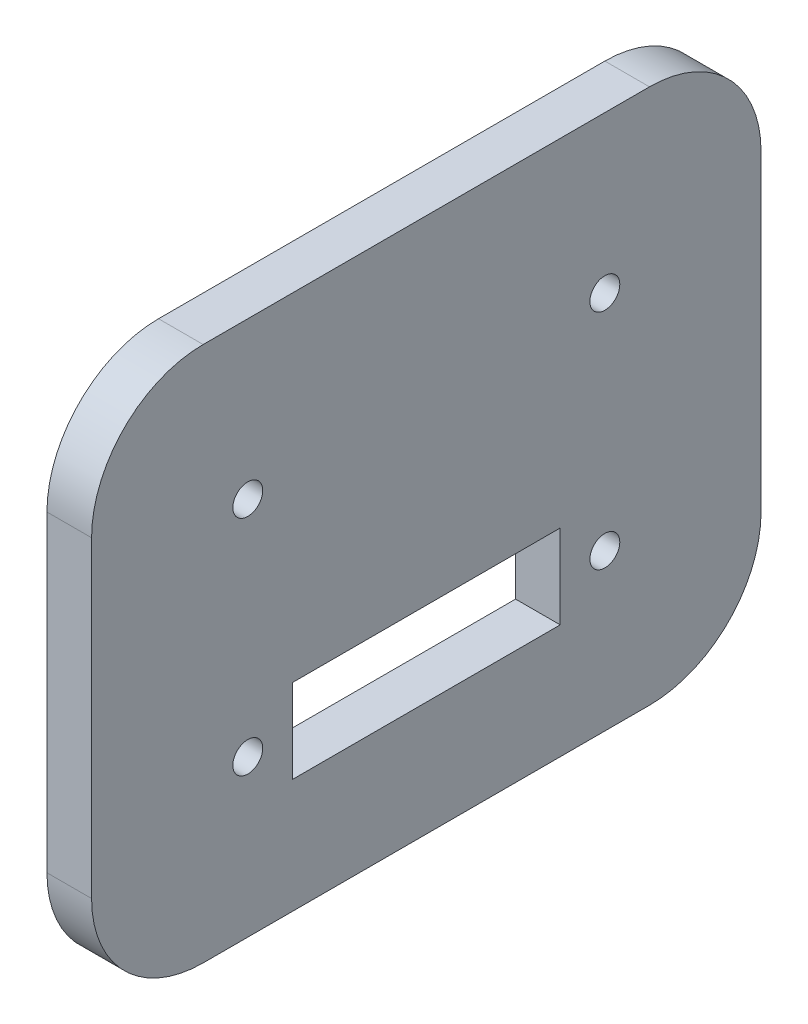
ISO-10303-21;
HEADER;
FILE_DESCRIPTION(('STEP AP214'),'2;1');
FILE_NAME('part.step','',(''),(''),'','','');
FILE_SCHEMA(('AUTOMOTIVE_DESIGN { 1 0 10303 214 1 1 1 1 }'));
ENDSEC;
DATA;
#1=APPLICATION_CONTEXT('core data for automotive mechanical design processes');
#2=APPLICATION_PROTOCOL_DEFINITION('international standard','automotive_design',2000,#1);
#3=PRODUCT_CONTEXT('',#1,'mechanical');
#4=PRODUCT('Part','Part','',(#3));
#5=PRODUCT_RELATED_PRODUCT_CATEGORY('part','',(#4));
#6=PRODUCT_DEFINITION_FORMATION('','',#4);
#7=PRODUCT_DEFINITION_CONTEXT('part definition',#1,'design');
#8=PRODUCT_DEFINITION('design','',#6,#7);
#9=PRODUCT_DEFINITION_SHAPE('','',#8);
#10=(LENGTH_UNIT() NAMED_UNIT(*) SI_UNIT(.MILLI.,.METRE.));
#11=(NAMED_UNIT(*) PLANE_ANGLE_UNIT() SI_UNIT($,.RADIAN.));
#12=(NAMED_UNIT(*) SI_UNIT($,.STERADIAN.) SOLID_ANGLE_UNIT());
#13=UNCERTAINTY_MEASURE_WITH_UNIT(LENGTH_MEASURE(1.E-05),#10,'distance_accuracy_value','');
#14=(GEOMETRIC_REPRESENTATION_CONTEXT(3) GLOBAL_UNCERTAINTY_ASSIGNED_CONTEXT((#13)) GLOBAL_UNIT_ASSIGNED_CONTEXT((#10,
#11,#12)) REPRESENTATION_CONTEXT('',''));
#15=CARTESIAN_POINT('',(0.,0.,0.));
#16=DIRECTION('',(0.,0.,1.));
#17=DIRECTION('',(1.,0.,0.));
#18=AXIS2_PLACEMENT_3D('',#15,#16,#17);
#19=CARTESIAN_POINT('',(2.54,-15.24,-19.05));
#20=DIRECTION('',(0.,0.,1.));
#21=DIRECTION('',(1.,0.,0.));
#22=AXIS2_PLACEMENT_3D('',#19,#20,#21);
#23=PLANE('',#22);
#24=DIRECTION('',(0.,1.,0.));
#25=VECTOR('',#24,1.);
#26=CARTESIAN_POINT('',(0.,-15.24,-19.05));
#27=LINE('',#26,#25);
#28=CARTESIAN_POINT('',(0.,-8.89,-19.05));
#29=VERTEX_POINT('',#28);
#30=CARTESIAN_POINT('',(0.,8.88999999999999,-19.05));
#31=VERTEX_POINT('',#30);
#32=EDGE_CURVE('E179',#29,#31,#27,.T.);
#33=ORIENTED_EDGE('',*,*,#32,.T.);
#34=DIRECTION('',(-1.,0.,0.));
#35=VECTOR('',#34,1.);
#36=CARTESIAN_POINT('',(2.54,8.89,-19.05));
#37=LINE('',#36,#35);
#38=CARTESIAN_POINT('',(2.54,8.88999999999999,-19.05));
#39=VERTEX_POINT('',#38);
#40=EDGE_CURVE('E221',#31,#39,#37,.F.);
#41=ORIENTED_EDGE('',*,*,#40,.T.);
#42=DIRECTION('',(0.,1.,0.));
#43=VECTOR('',#42,1.);
#44=CARTESIAN_POINT('',(2.54,-15.24,-19.05));
#45=LINE('',#44,#43);
#46=CARTESIAN_POINT('',(2.54,-8.89,-19.05));
#47=VERTEX_POINT('',#46);
#48=EDGE_CURVE('E182',#47,#39,#45,.T.);
#49=ORIENTED_EDGE('',*,*,#48,.F.);
#50=DIRECTION('',(-1.,0.,0.));
#51=VECTOR('',#50,1.);
#52=CARTESIAN_POINT('',(2.54,-8.89,-19.05));
#53=LINE('',#52,#51);
#54=EDGE_CURVE('E218',#47,#29,#53,.T.);
#55=ORIENTED_EDGE('',*,*,#54,.T.);
#56=EDGE_LOOP('',(#33,#41,#49,#55));
#57=FACE_BOUND('',#56,.T.);
#58=ADVANCED_FACE('F33',(#57),#23,.F.);
#59=CARTESIAN_POINT('',(2.54,15.24,19.05));
#60=DIRECTION('',(0.,-1.,0.));
#61=DIRECTION('',(0.,0.,-1.));
#62=AXIS2_PLACEMENT_3D('',#59,#60,#61);
#63=PLANE('',#62);
#64=DIRECTION('',(0.,0.,1.));
#65=VECTOR('',#64,1.);
#66=CARTESIAN_POINT('',(2.54,15.24,19.05));
#67=LINE('',#66,#65);
#68=CARTESIAN_POINT('',(2.54,15.24,-12.7));
#69=VERTEX_POINT('',#68);
#70=CARTESIAN_POINT('',(2.54,15.24,12.7));
#71=VERTEX_POINT('',#70);
#72=EDGE_CURVE('E185',#69,#71,#67,.T.);
#73=ORIENTED_EDGE('',*,*,#72,.F.);
#74=DIRECTION('',(-1.,0.,0.));
#75=VECTOR('',#74,1.);
#76=CARTESIAN_POINT('',(2.54,15.24,-12.7));
#77=LINE('',#76,#75);
#78=CARTESIAN_POINT('',(0.,15.24,-12.7));
#79=VERTEX_POINT('',#78);
#80=EDGE_CURVE('E207',#69,#79,#77,.T.);
#81=ORIENTED_EDGE('',*,*,#80,.T.);
#82=DIRECTION('',(0.,0.,1.));
#83=VECTOR('',#82,1.);
#84=CARTESIAN_POINT('',(0.,15.24,19.05));
#85=LINE('',#84,#83);
#86=CARTESIAN_POINT('',(0.,15.24,12.7));
#87=VERTEX_POINT('',#86);
#88=EDGE_CURVE('E198',#79,#87,#85,.T.);
#89=ORIENTED_EDGE('',*,*,#88,.T.);
#90=DIRECTION('',(-1.,0.,0.));
#91=VECTOR('',#90,1.);
#92=CARTESIAN_POINT('',(2.54,15.24,12.7));
#93=LINE('',#92,#91);
#94=EDGE_CURVE('E195',#87,#71,#93,.F.);
#95=ORIENTED_EDGE('',*,*,#94,.T.);
#96=EDGE_LOOP('',(#73,#81,#89,#95));
#97=FACE_BOUND('',#96,.T.);
#98=ADVANCED_FACE('F271',(#97),#63,.F.);
#99=CARTESIAN_POINT('',(2.54,-15.24,19.05));
#100=DIRECTION('',(0.,0.,-1.));
#101=DIRECTION('',(-1.,0.,0.));
#102=AXIS2_PLACEMENT_3D('',#99,#100,#101);
#103=PLANE('',#102);
#104=DIRECTION('',(0.,-1.,0.));
#105=VECTOR('',#104,1.);
#106=CARTESIAN_POINT('',(0.,-15.24,19.05));
#107=LINE('',#106,#105);
#108=CARTESIAN_POINT('',(0.,8.88999999999999,19.05));
#109=VERTEX_POINT('',#108);
#110=CARTESIAN_POINT('',(0.,-8.89,19.05));
#111=VERTEX_POINT('',#110);
#112=EDGE_CURVE('E201',#109,#111,#107,.T.);
#113=ORIENTED_EDGE('',*,*,#112,.T.);
#114=DIRECTION('',(-1.,0.,0.));
#115=VECTOR('',#114,1.);
#116=CARTESIAN_POINT('',(2.54,-8.89,19.05));
#117=LINE('',#116,#115);
#118=CARTESIAN_POINT('',(2.54,-8.89,19.05));
#119=VERTEX_POINT('',#118);
#120=EDGE_CURVE('E11',#111,#119,#117,.F.);
#121=ORIENTED_EDGE('',*,*,#120,.T.);
#122=DIRECTION('',(0.,-1.,0.));
#123=VECTOR('',#122,1.);
#124=CARTESIAN_POINT('',(2.54,-15.24,19.05));
#125=LINE('',#124,#123);
#126=CARTESIAN_POINT('',(2.54,8.88999999999999,19.05));
#127=VERTEX_POINT('',#126);
#128=EDGE_CURVE('E189',#127,#119,#125,.T.);
#129=ORIENTED_EDGE('',*,*,#128,.F.);
#130=DIRECTION('',(-1.,0.,0.));
#131=VECTOR('',#130,1.);
#132=CARTESIAN_POINT('',(2.54,8.89,19.05));
#133=LINE('',#132,#131);
#134=EDGE_CURVE('E41',#127,#109,#133,.T.);
#135=ORIENTED_EDGE('',*,*,#134,.T.);
#136=EDGE_LOOP('',(#113,#121,#129,#135));
#137=FACE_BOUND('',#136,.T.);
#138=ADVANCED_FACE('F240',(#137),#103,.F.);
#139=CARTESIAN_POINT('',(2.54,-15.24,19.05));
#140=DIRECTION('',(0.,1.,0.));
#141=DIRECTION('',(0.,0.,1.));
#142=AXIS2_PLACEMENT_3D('',#139,#140,#141);
#143=PLANE('',#142);
#144=DIRECTION('',(0.,0.,-1.));
#145=VECTOR('',#144,1.);
#146=CARTESIAN_POINT('',(0.,-15.24,19.05));
#147=LINE('',#146,#145);
#148=CARTESIAN_POINT('',(0.,-15.24,12.7));
#149=VERTEX_POINT('',#148);
#150=CARTESIAN_POINT('',(0.,-15.24,-12.7));
#151=VERTEX_POINT('',#150);
#152=EDGE_CURVE('E186',#149,#151,#147,.T.);
#153=ORIENTED_EDGE('',*,*,#152,.T.);
#154=DIRECTION('',(-1.,0.,0.));
#155=VECTOR('',#154,1.);
#156=CARTESIAN_POINT('',(2.54,-15.24,-12.7));
#157=LINE('',#156,#155);
#158=CARTESIAN_POINT('',(2.54,-15.24,-12.7));
#159=VERTEX_POINT('',#158);
#160=EDGE_CURVE('E234',#151,#159,#157,.F.);
#161=ORIENTED_EDGE('',*,*,#160,.T.);
#162=DIRECTION('',(0.,0.,-1.));
#163=VECTOR('',#162,1.);
#164=CARTESIAN_POINT('',(2.54,-15.24,19.05));
#165=LINE('',#164,#163);
#166=CARTESIAN_POINT('',(2.54,-15.24,12.7));
#167=VERTEX_POINT('',#166);
#168=EDGE_CURVE('E192',#167,#159,#165,.T.);
#169=ORIENTED_EDGE('',*,*,#168,.F.);
#170=DIRECTION('',(-1.,0.,0.));
#171=VECTOR('',#170,1.);
#172=CARTESIAN_POINT('',(2.54,-15.24,12.7));
#173=LINE('',#172,#171);
#174=EDGE_CURVE('E231',#167,#149,#173,.T.);
#175=ORIENTED_EDGE('',*,*,#174,.T.);
#176=EDGE_LOOP('',(#153,#161,#169,#175));
#177=FACE_BOUND('',#176,.T.);
#178=ADVANCED_FACE('F253',(#177),#143,.F.);
#179=CARTESIAN_POINT('',(2.54,0.,0.));
#180=DIRECTION('',(-1.,0.,0.));
#181=DIRECTION('',(0.,0.,1.));
#182=AXIS2_PLACEMENT_3D('',#179,#180,#181);
#183=PLANE('',#182);
#184=DIRECTION('',(0.,0.,1.));
#185=VECTOR('',#184,1.);
#186=CARTESIAN_POINT('',(2.54,-3.9624,7.62));
#187=LINE('',#186,#185);
#188=CARTESIAN_POINT('',(2.54,-3.9624,-7.62));
#189=VERTEX_POINT('',#188);
#190=CARTESIAN_POINT('',(2.54,-3.9624,7.62));
#191=VERTEX_POINT('',#190);
#192=EDGE_CURVE('E148',#189,#191,#187,.T.);
#193=ORIENTED_EDGE('',*,*,#192,.F.);
#194=DIRECTION('',(0.,1.,0.));
#195=VECTOR('',#194,1.);
#196=CARTESIAN_POINT('',(2.54,-8.7376,-7.62));
#197=LINE('',#196,#195);
#198=CARTESIAN_POINT('',(2.54,-8.7376,-7.62));
#199=VERTEX_POINT('',#198);
#200=EDGE_CURVE('E48',#199,#189,#197,.T.);
#201=ORIENTED_EDGE('',*,*,#200,.F.);
#202=DIRECTION('',(0.,0.,-1.));
#203=VECTOR('',#202,1.);
#204=CARTESIAN_POINT('',(2.54,-8.7376,7.62));
#205=LINE('',#204,#203);
#206=CARTESIAN_POINT('',(2.54,-8.7376,7.62));
#207=VERTEX_POINT('',#206);
#208=EDGE_CURVE('E139',#207,#199,#205,.T.);
#209=ORIENTED_EDGE('',*,*,#208,.F.);
#210=DIRECTION('',(0.,-1.,0.));
#211=VECTOR('',#210,1.);
#212=CARTESIAN_POINT('',(2.54,-8.7376,7.62));
#213=LINE('',#212,#211);
#214=EDGE_CURVE('E142',#191,#207,#213,.T.);
#215=ORIENTED_EDGE('',*,*,#214,.F.);
#216=EDGE_LOOP('',(#193,#201,#209,#215));
#217=FACE_BOUND('',#216,.T.);
#218=CARTESIAN_POINT('',(2.54,-6.35,10.16));
#219=DIRECTION('',(1.,0.,0.));
#220=DIRECTION('',(0.,0.,1.));
#221=AXIS2_PLACEMENT_3D('',#218,#219,#220);
#222=CIRCLE('',#221,0.850900000000001);
#223=CARTESIAN_POINT('',(2.54,-6.35,11.0109));
#224=VERTEX_POINT('',#223);
#225=EDGE_CURVE('E154',#224,#224,#222,.T.);
#226=ORIENTED_EDGE('',*,*,#225,.F.);
#227=EDGE_LOOP('',(#226));
#228=FACE_BOUND('',#227,.T.);
#229=CARTESIAN_POINT('',(2.54,-6.35,-10.16));
#230=DIRECTION('',(-1.,0.,0.));
#231=DIRECTION('',(0.,0.,-1.));
#232=AXIS2_PLACEMENT_3D('',#229,#230,#231);
#233=CIRCLE('',#232,0.850900000000001);
#234=CARTESIAN_POINT('',(2.54,-6.35,-11.0109));
#235=VERTEX_POINT('',#234);
#236=EDGE_CURVE('E161',#235,#235,#233,.T.);
#237=ORIENTED_EDGE('',*,*,#236,.T.);
#238=EDGE_LOOP('',(#237));
#239=FACE_BOUND('',#238,.T.);
#240=CARTESIAN_POINT('',(2.54,6.35,10.16));
#241=DIRECTION('',(-1.,0.,0.));
#242=DIRECTION('',(0.,0.,1.));
#243=AXIS2_PLACEMENT_3D('',#240,#241,#242);
#244=CIRCLE('',#243,0.850900000000001);
#245=CARTESIAN_POINT('',(2.54,6.35,11.0109));
#246=VERTEX_POINT('',#245);
#247=EDGE_CURVE('E167',#246,#246,#244,.T.);
#248=ORIENTED_EDGE('',*,*,#247,.T.);
#249=EDGE_LOOP('',(#248));
#250=FACE_BOUND('',#249,.T.);
#251=CARTESIAN_POINT('',(2.54,6.35,-10.16));
#252=DIRECTION('',(1.,0.,0.));
#253=DIRECTION('',(0.,0.,-1.));
#254=AXIS2_PLACEMENT_3D('',#251,#252,#253);
#255=CIRCLE('',#254,0.850900000000001);
#256=CARTESIAN_POINT('',(2.54,6.35,-11.0109));
#257=VERTEX_POINT('',#256);
#258=EDGE_CURVE('E173',#257,#257,#255,.T.);
#259=ORIENTED_EDGE('',*,*,#258,.F.);
#260=EDGE_LOOP('',(#259));
#261=FACE_BOUND('',#260,.T.);
#262=ORIENTED_EDGE('',*,*,#48,.T.);
#263=CARTESIAN_POINT('',(2.54,8.89,-12.7));
#264=DIRECTION('',(-1.,0.,0.));
#265=DIRECTION('',(0.,0.,1.));
#266=AXIS2_PLACEMENT_3D('',#263,#264,#265);
#267=CIRCLE('',#266,6.35);
#268=EDGE_CURVE('E229',#39,#69,#267,.F.);
#269=ORIENTED_EDGE('',*,*,#268,.T.);
#270=ORIENTED_EDGE('',*,*,#72,.T.);
#271=CARTESIAN_POINT('',(2.54,8.89,12.7));
#272=DIRECTION('',(-1.,0.,0.));
#273=DIRECTION('',(0.,0.,1.));
#274=AXIS2_PLACEMENT_3D('',#271,#272,#273);
#275=CIRCLE('',#274,6.35);
#276=EDGE_CURVE('E223',#71,#127,#275,.F.);
#277=ORIENTED_EDGE('',*,*,#276,.T.);
#278=ORIENTED_EDGE('',*,*,#128,.T.);
#279=CARTESIAN_POINT('',(2.54,-8.89,12.7));
#280=DIRECTION('',(-1.,0.,0.));
#281=DIRECTION('',(0.,0.,1.));
#282=AXIS2_PLACEMENT_3D('',#279,#280,#281);
#283=CIRCLE('',#282,6.35);
#284=EDGE_CURVE('E225',#119,#167,#283,.F.);
#285=ORIENTED_EDGE('',*,*,#284,.T.);
#286=ORIENTED_EDGE('',*,*,#168,.T.);
#287=CARTESIAN_POINT('',(2.54,-8.89,-12.7));
#288=DIRECTION('',(-1.,0.,0.));
#289=DIRECTION('',(0.,0.,1.));
#290=AXIS2_PLACEMENT_3D('',#287,#288,#289);
#291=CIRCLE('',#290,6.35);
#292=EDGE_CURVE('E227',#159,#47,#291,.F.);
#293=ORIENTED_EDGE('',*,*,#292,.T.);
#294=EDGE_LOOP('',(#262,#269,#270,#277,#278,#285,#286,#293));
#295=FACE_BOUND('',#294,.T.);
#296=ADVANCED_FACE('F257',(#217,#228,#239,#250,#261,#295),#183,.F.);
#297=CARTESIAN_POINT('',(0.,0.,0.));
#298=DIRECTION('',(-1.,0.,0.));
#299=DIRECTION('',(0.,0.,1.));
#300=AXIS2_PLACEMENT_3D('',#297,#298,#299);
#301=PLANE('',#300);
#302=DIRECTION('',(0.,1.,0.));
#303=VECTOR('',#302,1.);
#304=CARTESIAN_POINT('',(0.,-8.7376,-7.62));
#305=LINE('',#304,#303);
#306=CARTESIAN_POINT('',(0.,-8.7376,-7.62));
#307=VERTEX_POINT('',#306);
#308=CARTESIAN_POINT('',(0.,-3.9624,-7.62));
#309=VERTEX_POINT('',#308);
#310=EDGE_CURVE('E123',#307,#309,#305,.T.);
#311=ORIENTED_EDGE('',*,*,#310,.T.);
#312=DIRECTION('',(0.,0.,1.));
#313=VECTOR('',#312,1.);
#314=CARTESIAN_POINT('',(0.,-3.9624,7.62));
#315=LINE('',#314,#313);
#316=CARTESIAN_POINT('',(0.,-3.9624,7.62));
#317=VERTEX_POINT('',#316);
#318=EDGE_CURVE('E132',#309,#317,#315,.T.);
#319=ORIENTED_EDGE('',*,*,#318,.T.);
#320=DIRECTION('',(0.,-1.,0.));
#321=VECTOR('',#320,1.);
#322=CARTESIAN_POINT('',(0.,-8.7376,7.62));
#323=LINE('',#322,#321);
#324=CARTESIAN_POINT('',(0.,-8.7376,7.62));
#325=VERTEX_POINT('',#324);
#326=EDGE_CURVE('E56',#317,#325,#323,.T.);
#327=ORIENTED_EDGE('',*,*,#326,.T.);
#328=DIRECTION('',(0.,0.,-1.));
#329=VECTOR('',#328,1.);
#330=CARTESIAN_POINT('',(0.,-8.7376,7.62));
#331=LINE('',#330,#329);
#332=EDGE_CURVE('E129',#325,#307,#331,.T.);
#333=ORIENTED_EDGE('',*,*,#332,.T.);
#334=EDGE_LOOP('',(#311,#319,#327,#333));
#335=FACE_BOUND('',#334,.T.);
#336=CARTESIAN_POINT('',(0.,-6.35,10.16));
#337=DIRECTION('',(1.,0.,0.));
#338=DIRECTION('',(0.,0.,1.));
#339=AXIS2_PLACEMENT_3D('',#336,#337,#338);
#340=CIRCLE('',#339,0.850900000000001);
#341=CARTESIAN_POINT('',(0.,-6.35,11.0109));
#342=VERTEX_POINT('',#341);
#343=EDGE_CURVE('E158',#342,#342,#340,.T.);
#344=ORIENTED_EDGE('',*,*,#343,.T.);
#345=EDGE_LOOP('',(#344));
#346=FACE_BOUND('',#345,.T.);
#347=CARTESIAN_POINT('',(0.,-6.35,-10.16));
#348=DIRECTION('',(-1.,0.,0.));
#349=DIRECTION('',(0.,0.,-1.));
#350=AXIS2_PLACEMENT_3D('',#347,#348,#349);
#351=CIRCLE('',#350,0.850900000000001);
#352=CARTESIAN_POINT('',(0.,-6.35,-11.0109));
#353=VERTEX_POINT('',#352);
#354=EDGE_CURVE('E164',#353,#353,#351,.T.);
#355=ORIENTED_EDGE('',*,*,#354,.F.);
#356=EDGE_LOOP('',(#355));
#357=FACE_BOUND('',#356,.T.);
#358=CARTESIAN_POINT('',(0.,6.35,10.16));
#359=DIRECTION('',(-1.,0.,0.));
#360=DIRECTION('',(0.,0.,1.));
#361=AXIS2_PLACEMENT_3D('',#358,#359,#360);
#362=CIRCLE('',#361,0.850900000000001);
#363=CARTESIAN_POINT('',(0.,6.35,11.0109));
#364=VERTEX_POINT('',#363);
#365=EDGE_CURVE('E170',#364,#364,#362,.T.);
#366=ORIENTED_EDGE('',*,*,#365,.F.);
#367=EDGE_LOOP('',(#366));
#368=FACE_BOUND('',#367,.T.);
#369=CARTESIAN_POINT('',(0.,6.35,-10.16));
#370=DIRECTION('',(1.,0.,0.));
#371=DIRECTION('',(0.,0.,-1.));
#372=AXIS2_PLACEMENT_3D('',#369,#370,#371);
#373=CIRCLE('',#372,0.850900000000001);
#374=CARTESIAN_POINT('',(0.,6.35,-11.0109));
#375=VERTEX_POINT('',#374);
#376=EDGE_CURVE('E176',#375,#375,#373,.T.);
#377=ORIENTED_EDGE('',*,*,#376,.T.);
#378=EDGE_LOOP('',(#377));
#379=FACE_BOUND('',#378,.T.);
#380=ORIENTED_EDGE('',*,*,#88,.F.);
#381=CARTESIAN_POINT('',(0.,8.89,-12.7));
#382=DIRECTION('',(-1.,0.,0.));
#383=DIRECTION('',(0.,0.,1.));
#384=AXIS2_PLACEMENT_3D('',#381,#382,#383);
#385=CIRCLE('',#384,6.35);
#386=EDGE_CURVE('E216',#79,#31,#385,.T.);
#387=ORIENTED_EDGE('',*,*,#386,.T.);
#388=ORIENTED_EDGE('',*,*,#32,.F.);
#389=CARTESIAN_POINT('',(0.,-8.89,-12.7));
#390=DIRECTION('',(-1.,0.,0.));
#391=DIRECTION('',(0.,0.,1.));
#392=AXIS2_PLACEMENT_3D('',#389,#390,#391);
#393=CIRCLE('',#392,6.35);
#394=EDGE_CURVE('E214',#29,#151,#393,.T.);
#395=ORIENTED_EDGE('',*,*,#394,.T.);
#396=ORIENTED_EDGE('',*,*,#152,.F.);
#397=CARTESIAN_POINT('',(0.,-8.89,12.7));
#398=DIRECTION('',(-1.,0.,0.));
#399=DIRECTION('',(0.,0.,1.));
#400=AXIS2_PLACEMENT_3D('',#397,#398,#399);
#401=CIRCLE('',#400,6.35);
#402=EDGE_CURVE('E212',#149,#111,#401,.T.);
#403=ORIENTED_EDGE('',*,*,#402,.T.);
#404=ORIENTED_EDGE('',*,*,#112,.F.);
#405=CARTESIAN_POINT('',(0.,8.89,12.7));
#406=DIRECTION('',(-1.,0.,0.));
#407=DIRECTION('',(0.,0.,1.));
#408=AXIS2_PLACEMENT_3D('',#405,#406,#407);
#409=CIRCLE('',#408,6.35);
#410=EDGE_CURVE('E210',#109,#87,#409,.T.);
#411=ORIENTED_EDGE('',*,*,#410,.T.);
#412=EDGE_LOOP('',(#380,#387,#388,#395,#396,#403,#404,#411));
#413=FACE_BOUND('',#412,.T.);
#414=ADVANCED_FACE('F136',(#335,#346,#357,#368,#379,#413),#301,.T.);
#415=CARTESIAN_POINT('',(0.,6.35,-10.16));
#416=DIRECTION('',(1.,0.,0.));
#417=DIRECTION('',(0.,0.,-1.));
#418=AXIS2_PLACEMENT_3D('',#415,#416,#417);
#419=CYLINDRICAL_SURFACE('',#418,0.850900000000001);
#420=ORIENTED_EDGE('',*,*,#376,.F.);
#421=EDGE_LOOP('',(#420));
#422=FACE_BOUND('',#421,.T.);
#423=ORIENTED_EDGE('',*,*,#258,.T.);
#424=EDGE_LOOP('',(#423));
#425=FACE_BOUND('',#424,.T.);
#426=ADVANCED_FACE('F326',(#422,#425),#419,.F.);
#427=CARTESIAN_POINT('',(0.,6.35,10.16));
#428=DIRECTION('',(1.,0.,0.));
#429=DIRECTION('',(0.,0.,-1.));
#430=AXIS2_PLACEMENT_3D('',#427,#428,#429);
#431=CYLINDRICAL_SURFACE('',#430,0.850900000000001);
#432=ORIENTED_EDGE('',*,*,#365,.T.);
#433=EDGE_LOOP('',(#432));
#434=FACE_BOUND('',#433,.T.);
#435=ORIENTED_EDGE('',*,*,#247,.F.);
#436=EDGE_LOOP('',(#435));
#437=FACE_BOUND('',#436,.T.);
#438=ADVANCED_FACE('F369',(#434,#437),#431,.F.);
#439=CARTESIAN_POINT('',(0.,-6.35,-10.16));
#440=DIRECTION('',(1.,0.,0.));
#441=DIRECTION('',(0.,0.,-1.));
#442=AXIS2_PLACEMENT_3D('',#439,#440,#441);
#443=CYLINDRICAL_SURFACE('',#442,0.850900000000001);
#444=ORIENTED_EDGE('',*,*,#354,.T.);
#445=EDGE_LOOP('',(#444));
#446=FACE_BOUND('',#445,.T.);
#447=ORIENTED_EDGE('',*,*,#236,.F.);
#448=EDGE_LOOP('',(#447));
#449=FACE_BOUND('',#448,.T.);
#450=ADVANCED_FACE('F365',(#446,#449),#443,.F.);
#451=CARTESIAN_POINT('',(0.,-6.35,10.16));
#452=DIRECTION('',(1.,0.,0.));
#453=DIRECTION('',(0.,0.,-1.));
#454=AXIS2_PLACEMENT_3D('',#451,#452,#453);
#455=CYLINDRICAL_SURFACE('',#454,0.850900000000001);
#456=ORIENTED_EDGE('',*,*,#343,.F.);
#457=EDGE_LOOP('',(#456));
#458=FACE_BOUND('',#457,.T.);
#459=ORIENTED_EDGE('',*,*,#225,.T.);
#460=EDGE_LOOP('',(#459));
#461=FACE_BOUND('',#460,.T.);
#462=ADVANCED_FACE('F290',(#458,#461),#455,.F.);
#463=CARTESIAN_POINT('',(2.54,8.89,-12.7));
#464=DIRECTION('',(-1.,0.,0.));
#465=DIRECTION('',(0.,0.,1.));
#466=AXIS2_PLACEMENT_3D('',#463,#464,#465);
#467=CYLINDRICAL_SURFACE('',#466,6.35);
#468=ORIENTED_EDGE('',*,*,#268,.F.);
#469=ORIENTED_EDGE('',*,*,#40,.F.);
#470=ORIENTED_EDGE('',*,*,#386,.F.);
#471=ORIENTED_EDGE('',*,*,#80,.F.);
#472=EDGE_LOOP('',(#468,#469,#470,#471));
#473=FACE_BOUND('',#472,.T.);
#474=ADVANCED_FACE('F268',(#473),#467,.T.);
#475=CARTESIAN_POINT('',(2.54,-8.89,-12.7));
#476=DIRECTION('',(-1.,0.,0.));
#477=DIRECTION('',(0.,0.,1.));
#478=AXIS2_PLACEMENT_3D('',#475,#476,#477);
#479=CYLINDRICAL_SURFACE('',#478,6.35);
#480=ORIENTED_EDGE('',*,*,#292,.F.);
#481=ORIENTED_EDGE('',*,*,#160,.F.);
#482=ORIENTED_EDGE('',*,*,#394,.F.);
#483=ORIENTED_EDGE('',*,*,#54,.F.);
#484=EDGE_LOOP('',(#480,#481,#482,#483));
#485=FACE_BOUND('',#484,.T.);
#486=ADVANCED_FACE('F261',(#485),#479,.T.);
#487=CARTESIAN_POINT('',(2.54,-8.89,12.7));
#488=DIRECTION('',(-1.,0.,0.));
#489=DIRECTION('',(0.,0.,1.));
#490=AXIS2_PLACEMENT_3D('',#487,#488,#489);
#491=CYLINDRICAL_SURFACE('',#490,6.35);
#492=ORIENTED_EDGE('',*,*,#284,.F.);
#493=ORIENTED_EDGE('',*,*,#120,.F.);
#494=ORIENTED_EDGE('',*,*,#402,.F.);
#495=ORIENTED_EDGE('',*,*,#174,.F.);
#496=EDGE_LOOP('',(#492,#493,#494,#495));
#497=FACE_BOUND('',#496,.T.);
#498=ADVANCED_FACE('F250',(#497),#491,.T.);
#499=CARTESIAN_POINT('',(2.54,8.89,12.7));
#500=DIRECTION('',(-1.,0.,0.));
#501=DIRECTION('',(0.,0.,1.));
#502=AXIS2_PLACEMENT_3D('',#499,#500,#501);
#503=CYLINDRICAL_SURFACE('',#502,6.35);
#504=ORIENTED_EDGE('',*,*,#276,.F.);
#505=ORIENTED_EDGE('',*,*,#94,.F.);
#506=ORIENTED_EDGE('',*,*,#410,.F.);
#507=ORIENTED_EDGE('',*,*,#134,.F.);
#508=EDGE_LOOP('',(#504,#505,#506,#507));
#509=FACE_BOUND('',#508,.T.);
#510=ADVANCED_FACE('F35',(#509),#503,.T.);
#511=CARTESIAN_POINT('',(0.,-8.7376,-7.62));
#512=DIRECTION('',(0.,0.,-1.));
#513=DIRECTION('',(-1.,0.,0.));
#514=AXIS2_PLACEMENT_3D('',#511,#512,#513);
#515=PLANE('',#514);
#516=ORIENTED_EDGE('',*,*,#200,.T.);
#517=DIRECTION('',(1.,0.,0.));
#518=VECTOR('',#517,1.);
#519=CARTESIAN_POINT('',(0.,-3.9624,-7.62));
#520=LINE('',#519,#518);
#521=EDGE_CURVE('E119',#309,#189,#520,.T.);
#522=ORIENTED_EDGE('',*,*,#521,.F.);
#523=ORIENTED_EDGE('',*,*,#310,.F.);
#524=DIRECTION('',(1.,0.,0.));
#525=VECTOR('',#524,1.);
#526=CARTESIAN_POINT('',(0.,-8.7376,-7.62));
#527=LINE('',#526,#525);
#528=EDGE_CURVE('E152',#307,#199,#527,.T.);
#529=ORIENTED_EDGE('',*,*,#528,.T.);
#530=EDGE_LOOP('',(#516,#522,#523,#529));
#531=FACE_BOUND('',#530,.T.);
#532=ADVANCED_FACE('F121',(#531),#515,.F.);
#533=CARTESIAN_POINT('',(0.,-8.7376,7.62));
#534=DIRECTION('',(0.,-1.,0.));
#535=DIRECTION('',(0.,0.,-1.));
#536=AXIS2_PLACEMENT_3D('',#533,#534,#535);
#537=PLANE('',#536);
#538=ORIENTED_EDGE('',*,*,#208,.T.);
#539=ORIENTED_EDGE('',*,*,#528,.F.);
#540=ORIENTED_EDGE('',*,*,#332,.F.);
#541=DIRECTION('',(1.,0.,0.));
#542=VECTOR('',#541,1.);
#543=CARTESIAN_POINT('',(0.,-8.7376,7.62));
#544=LINE('',#543,#542);
#545=EDGE_CURVE('E155',#325,#207,#544,.T.);
#546=ORIENTED_EDGE('',*,*,#545,.T.);
#547=EDGE_LOOP('',(#538,#539,#540,#546));
#548=FACE_BOUND('',#547,.T.);
#549=ADVANCED_FACE('F278',(#548),#537,.F.);
#550=CARTESIAN_POINT('',(0.,-8.7376,7.62));
#551=DIRECTION('',(0.,0.,1.));
#552=DIRECTION('',(1.,0.,0.));
#553=AXIS2_PLACEMENT_3D('',#550,#551,#552);
#554=PLANE('',#553);
#555=ORIENTED_EDGE('',*,*,#214,.T.);
#556=ORIENTED_EDGE('',*,*,#545,.F.);
#557=ORIENTED_EDGE('',*,*,#326,.F.);
#558=DIRECTION('',(1.,0.,0.));
#559=VECTOR('',#558,1.);
#560=CARTESIAN_POINT('',(0.,-3.9624,7.62));
#561=LINE('',#560,#559);
#562=EDGE_CURVE('E128',#317,#191,#561,.T.);
#563=ORIENTED_EDGE('',*,*,#562,.T.);
#564=EDGE_LOOP('',(#555,#556,#557,#563));
#565=FACE_BOUND('',#564,.T.);
#566=ADVANCED_FACE('F342',(#565),#554,.F.);
#567=CARTESIAN_POINT('',(0.,-3.9624,7.62));
#568=DIRECTION('',(0.,1.,0.));
#569=DIRECTION('',(0.,0.,1.));
#570=AXIS2_PLACEMENT_3D('',#567,#568,#569);
#571=PLANE('',#570);
#572=ORIENTED_EDGE('',*,*,#192,.T.);
#573=ORIENTED_EDGE('',*,*,#562,.F.);
#574=ORIENTED_EDGE('',*,*,#318,.F.);
#575=ORIENTED_EDGE('',*,*,#521,.T.);
#576=EDGE_LOOP('',(#572,#573,#574,#575));
#577=FACE_BOUND('',#576,.T.);
#578=ADVANCED_FACE('F133',(#577),#571,.F.);
#579=CLOSED_SHELL('',(#58,#98,#138,#178,#296,#414,#426,#438,#450,#462,#474,#486,#498,#510,#532,
#549,#566,#578));
#580=MANIFOLD_SOLID_BREP('B2',#579);
#581=ADVANCED_BREP_SHAPE_REPRESENTATION('',(#18,#580),#14);
#582=SHAPE_DEFINITION_REPRESENTATION(#9,#581);
ENDSEC;
END-ISO-10303-21;
